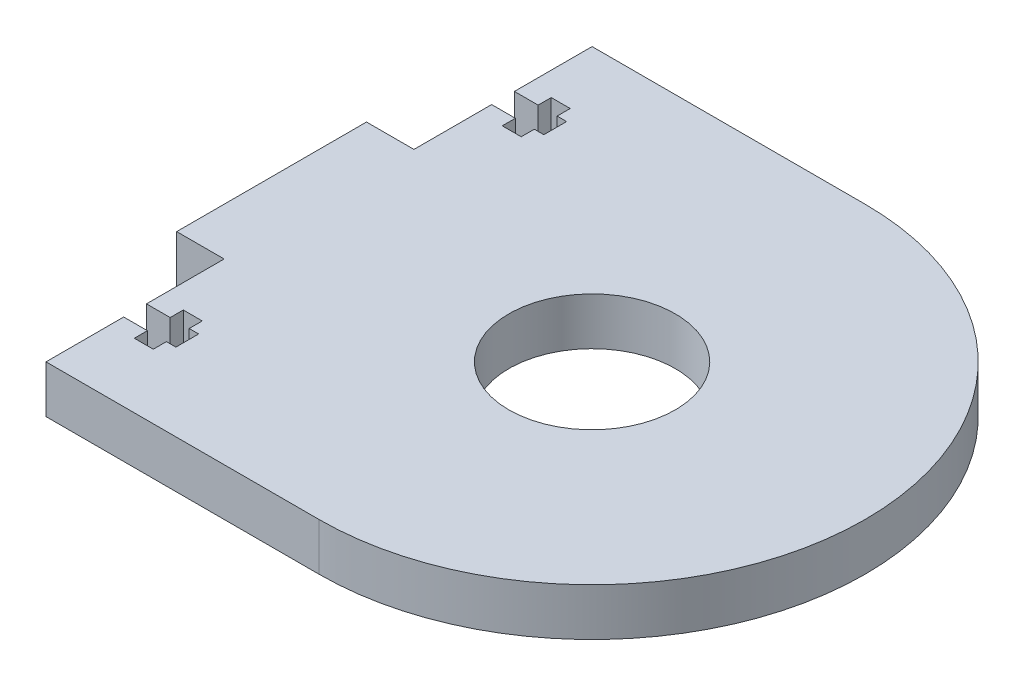
ISO-10303-21;
HEADER;
FILE_DESCRIPTION(('STEP AP214'),'2;1');
FILE_NAME('part.step','',(''),(''),'','','');
FILE_SCHEMA(('AUTOMOTIVE_DESIGN { 1 0 10303 214 1 1 1 1 }'));
ENDSEC;
DATA;
#1=APPLICATION_CONTEXT('core data for automotive mechanical design processes');
#2=APPLICATION_PROTOCOL_DEFINITION('international standard','automotive_design',2000,#1);
#3=PRODUCT_CONTEXT('',#1,'mechanical');
#4=PRODUCT('Part','Part','',(#3));
#5=PRODUCT_RELATED_PRODUCT_CATEGORY('part','',(#4));
#6=PRODUCT_DEFINITION_FORMATION('','',#4);
#7=PRODUCT_DEFINITION_CONTEXT('part definition',#1,'design');
#8=PRODUCT_DEFINITION('design','',#6,#7);
#9=PRODUCT_DEFINITION_SHAPE('','',#8);
#10=(LENGTH_UNIT() NAMED_UNIT(*) SI_UNIT(.MILLI.,.METRE.));
#11=(NAMED_UNIT(*) PLANE_ANGLE_UNIT() SI_UNIT($,.RADIAN.));
#12=(NAMED_UNIT(*) SI_UNIT($,.STERADIAN.) SOLID_ANGLE_UNIT());
#13=UNCERTAINTY_MEASURE_WITH_UNIT(LENGTH_MEASURE(1.E-05),#10,'distance_accuracy_value','');
#14=(GEOMETRIC_REPRESENTATION_CONTEXT(3) GLOBAL_UNCERTAINTY_ASSIGNED_CONTEXT((#13)) GLOBAL_UNIT_ASSIGNED_CONTEXT((#10,
#11,#12)) REPRESENTATION_CONTEXT('',''));
#15=CARTESIAN_POINT('',(0.,0.,0.));
#16=DIRECTION('',(0.,0.,1.));
#17=DIRECTION('',(1.,0.,0.));
#18=AXIS2_PLACEMENT_3D('',#15,#16,#17);
#19=CARTESIAN_POINT('',(2.36809678728789,6.35,0.403451606355909));
#20=DIRECTION('',(0.,1.,0.));
#21=DIRECTION('',(0.,0.,1.));
#22=AXIS2_PLACEMENT_3D('',#19,#20,#21);
#23=PLANE('',#22);
#24=CARTESIAN_POINT('',(2.36809678728789,6.35,0.403451606355909));
#25=DIRECTION('',(0.,1.,0.));
#26=DIRECTION('',(0.,0.,1.));
#27=AXIS2_PLACEMENT_3D('',#24,#25,#26);
#28=CIRCLE('',#27,36.5379);
#29=CARTESIAN_POINT('',(2.36809678728811,6.35,36.9413516063559));
#30=VERTEX_POINT('',#29);
#31=CARTESIAN_POINT('',(2.36809678728789,6.35,-36.1344483936441));
#32=VERTEX_POINT('',#31);
#33=EDGE_CURVE('E336',#30,#32,#28,.T.);
#34=ORIENTED_EDGE('',*,*,#33,.T.);
#35=DIRECTION('',(-1.,0.,0.));
#36=VECTOR('',#35,1.);
#37=CARTESIAN_POINT('',(2.36809678728789,6.35,-36.1344483936441));
#38=LINE('',#37,#36);
#39=CARTESIAN_POINT('',(-34.169803212712,6.35,-36.1344483936439));
#40=VERTEX_POINT('',#39);
#41=EDGE_CURVE('E164',#32,#40,#38,.T.);
#42=ORIENTED_EDGE('',*,*,#41,.T.);
#43=DIRECTION('',(0.,0.,1.));
#44=VECTOR('',#43,1.);
#45=CARTESIAN_POINT('',(-34.169803212712,6.35,-36.1344483936439));
#46=LINE('',#45,#44);
#47=CARTESIAN_POINT('',(-34.169803212712,6.35,-25.7394632326821));
#48=VERTEX_POINT('',#47);
#49=EDGE_CURVE('E423',#40,#48,#46,.T.);
#50=ORIENTED_EDGE('',*,*,#49,.T.);
#51=DIRECTION('',(1.,0.,0.));
#52=VECTOR('',#51,1.);
#53=CARTESIAN_POINT('',(-30.9948032127121,6.35,-25.7394632326821));
#54=LINE('',#53,#52);
#55=CARTESIAN_POINT('',(-30.9948032127121,6.35,-25.7394632326821));
#56=VERTEX_POINT('',#55);
#57=EDGE_CURVE('E442',#48,#56,#54,.T.);
#58=ORIENTED_EDGE('',*,*,#57,.T.);
#59=DIRECTION('',(0.,0.,-1.));
#60=VECTOR('',#59,1.);
#61=CARTESIAN_POINT('',(-30.9948032127121,6.35,-27.4920632326822));
#62=LINE('',#61,#60);
#63=CARTESIAN_POINT('',(-30.9948032127121,6.35,-27.4920632326822));
#64=VERTEX_POINT('',#63);
#65=EDGE_CURVE('E439',#56,#64,#62,.T.);
#66=ORIENTED_EDGE('',*,*,#65,.T.);
#67=DIRECTION('',(1.,0.,0.));
#68=VECTOR('',#67,1.);
#69=CARTESIAN_POINT('',(-28.4548032127121,6.35,-27.4920632326822));
#70=LINE('',#69,#68);
#71=CARTESIAN_POINT('',(-28.4548032127121,6.35,-27.4920632326822));
#72=VERTEX_POINT('',#71);
#73=EDGE_CURVE('E441',#64,#72,#70,.T.);
#74=ORIENTED_EDGE('',*,*,#73,.T.);
#75=DIRECTION('',(0.,0.,1.));
#76=VECTOR('',#75,1.);
#77=CARTESIAN_POINT('',(-28.4548032127121,6.35,-25.7394632326821));
#78=LINE('',#77,#76);
#79=CARTESIAN_POINT('',(-28.4548032127121,6.35,-25.7394632326821));
#80=VERTEX_POINT('',#79);
#81=EDGE_CURVE('E444',#72,#80,#78,.T.);
#82=ORIENTED_EDGE('',*,*,#81,.T.);
#83=DIRECTION('',(1.,0.,0.));
#84=VECTOR('',#83,1.);
#85=CARTESIAN_POINT('',(-27.1848032127122,6.35,-25.7394632326821));
#86=LINE('',#85,#84);
#87=CARTESIAN_POINT('',(-27.1848032127122,6.35,-25.7394632326821));
#88=VERTEX_POINT('',#87);
#89=EDGE_CURVE('E450',#80,#88,#86,.T.);
#90=ORIENTED_EDGE('',*,*,#89,.T.);
#91=DIRECTION('',(0.,0.,1.));
#92=VECTOR('',#91,1.);
#93=CARTESIAN_POINT('',(-27.1848032127122,6.35,-25.7394632326821));
#94=LINE('',#93,#92);
#95=CARTESIAN_POINT('',(-27.1848032127122,6.35,-22.6916038765292));
#96=VERTEX_POINT('',#95);
#97=EDGE_CURVE('E452',#88,#96,#94,.T.);
#98=ORIENTED_EDGE('',*,*,#97,.T.);
#99=DIRECTION('',(-1.,0.,0.));
#100=VECTOR('',#99,1.);
#101=CARTESIAN_POINT('',(-27.1848032127122,6.35,-22.6916038765292));
#102=LINE('',#101,#100);
#103=CARTESIAN_POINT('',(-28.4548032127121,6.35,-22.6916038765292));
#104=VERTEX_POINT('',#103);
#105=EDGE_CURVE('E454',#96,#104,#102,.T.);
#106=ORIENTED_EDGE('',*,*,#105,.T.);
#107=DIRECTION('',(0.,0.,1.));
#108=VECTOR('',#107,1.);
#109=CARTESIAN_POINT('',(-28.4548032127121,6.35,-22.6916038765292));
#110=LINE('',#109,#108);
#111=CARTESIAN_POINT('',(-28.4548032127121,6.35,-20.9390038765292));
#112=VERTEX_POINT('',#111);
#113=EDGE_CURVE('E456',#104,#112,#110,.T.);
#114=ORIENTED_EDGE('',*,*,#113,.T.);
#115=DIRECTION('',(-1.,0.,0.));
#116=VECTOR('',#115,1.);
#117=CARTESIAN_POINT('',(-28.4548032127121,6.35,-20.9390038765292));
#118=LINE('',#117,#116);
#119=CARTESIAN_POINT('',(-30.9948032127121,6.35,-20.9390038765292));
#120=VERTEX_POINT('',#119);
#121=EDGE_CURVE('E458',#112,#120,#118,.T.);
#122=ORIENTED_EDGE('',*,*,#121,.T.);
#123=DIRECTION('',(0.,0.,-1.));
#124=VECTOR('',#123,1.);
#125=CARTESIAN_POINT('',(-30.9948032127121,6.35,-20.9390038765292));
#126=LINE('',#125,#124);
#127=CARTESIAN_POINT('',(-30.9948032127121,6.35,-22.6916038765292));
#128=VERTEX_POINT('',#127);
#129=EDGE_CURVE('E460',#120,#128,#126,.T.);
#130=ORIENTED_EDGE('',*,*,#129,.T.);
#131=DIRECTION('',(-1.,0.,0.));
#132=VECTOR('',#131,1.);
#133=CARTESIAN_POINT('',(-30.9948032127121,6.35,-22.6916038765292));
#134=LINE('',#133,#132);
#135=CARTESIAN_POINT('',(-34.169803212712,6.35,-22.6916038765292));
#136=VERTEX_POINT('',#135);
#137=EDGE_CURVE('E462',#128,#136,#134,.T.);
#138=ORIENTED_EDGE('',*,*,#137,.T.);
#139=DIRECTION('',(0.,0.,1.));
#140=VECTOR('',#139,1.);
#141=CARTESIAN_POINT('',(-34.169803212712,6.35,-22.6916038765292));
#142=LINE('',#141,#140);
#143=CARTESIAN_POINT('',(-34.1698032127118,6.35,-12.2965483936441));
#144=VERTEX_POINT('',#143);
#145=EDGE_CURVE('E464',#136,#144,#142,.T.);
#146=ORIENTED_EDGE('',*,*,#145,.T.);
#147=DIRECTION('',(-1.,0.,0.));
#148=VECTOR('',#147,1.);
#149=CARTESIAN_POINT('',(-34.1698032127118,6.35,-12.2965483936441));
#150=LINE('',#149,#148);
#151=CARTESIAN_POINT('',(-40.5198032127117,6.35,-12.2965483936441));
#152=VERTEX_POINT('',#151);
#153=EDGE_CURVE('E466',#144,#152,#150,.T.);
#154=ORIENTED_EDGE('',*,*,#153,.T.);
#155=DIRECTION('',(0.,0.,1.));
#156=VECTOR('',#155,1.);
#157=CARTESIAN_POINT('',(-40.5198032127117,6.35,-12.2965483936441));
#158=LINE('',#157,#156);
#159=CARTESIAN_POINT('',(-40.5198032127117,6.35,13.1034516063559));
#160=VERTEX_POINT('',#159);
#161=EDGE_CURVE('E468',#152,#160,#158,.T.);
#162=ORIENTED_EDGE('',*,*,#161,.T.);
#163=DIRECTION('',(1.,0.,0.));
#164=VECTOR('',#163,1.);
#165=CARTESIAN_POINT('',(-40.5198032127117,6.35,13.1034516063559));
#166=LINE('',#165,#164);
#167=CARTESIAN_POINT('',(-34.1698032127118,6.35,13.1034516063559));
#168=VERTEX_POINT('',#167);
#169=EDGE_CURVE('E470',#160,#168,#166,.T.);
#170=ORIENTED_EDGE('',*,*,#169,.T.);
#171=DIRECTION('',(0.,0.,1.));
#172=VECTOR('',#171,1.);
#173=CARTESIAN_POINT('',(-34.1698032127118,6.35,13.1034516063559));
#174=LINE('',#173,#172);
#175=CARTESIAN_POINT('',(-34.1698032127118,6.35,23.4984367673177));
#176=VERTEX_POINT('',#175);
#177=EDGE_CURVE('E472',#168,#176,#174,.T.);
#178=ORIENTED_EDGE('',*,*,#177,.T.);
#179=DIRECTION('',(1.,0.,0.));
#180=VECTOR('',#179,1.);
#181=CARTESIAN_POINT('',(-30.9948032127116,6.35,23.4984367673177));
#182=LINE('',#181,#180);
#183=CARTESIAN_POINT('',(-30.9948032127116,6.35,23.4984367673177));
#184=VERTEX_POINT('',#183);
#185=EDGE_CURVE('E474',#176,#184,#182,.T.);
#186=ORIENTED_EDGE('',*,*,#185,.T.);
#187=DIRECTION('',(0.,0.,-1.));
#188=VECTOR('',#187,1.);
#189=CARTESIAN_POINT('',(-30.9948032127116,6.35,21.7458367673177));
#190=LINE('',#189,#188);
#191=CARTESIAN_POINT('',(-30.9948032127116,6.35,21.7458367673177));
#192=VERTEX_POINT('',#191);
#193=EDGE_CURVE('E476',#184,#192,#190,.T.);
#194=ORIENTED_EDGE('',*,*,#193,.T.);
#195=DIRECTION('',(1.,0.,0.));
#196=VECTOR('',#195,1.);
#197=CARTESIAN_POINT('',(-28.4548032127117,6.35,21.7458367673177));
#198=LINE('',#197,#196);
#199=CARTESIAN_POINT('',(-28.4548032127117,6.35,21.7458367673177));
#200=VERTEX_POINT('',#199);
#201=EDGE_CURVE('E478',#192,#200,#198,.T.);
#202=ORIENTED_EDGE('',*,*,#201,.T.);
#203=DIRECTION('',(0.,0.,1.));
#204=VECTOR('',#203,1.);
#205=CARTESIAN_POINT('',(-28.4548032127117,6.35,23.4984367673177));
#206=LINE('',#205,#204);
#207=CARTESIAN_POINT('',(-28.4548032127117,6.35,23.4984367673177));
#208=VERTEX_POINT('',#207);
#209=EDGE_CURVE('E480',#200,#208,#206,.T.);
#210=ORIENTED_EDGE('',*,*,#209,.T.);
#211=DIRECTION('',(1.,0.,0.));
#212=VECTOR('',#211,1.);
#213=CARTESIAN_POINT('',(-27.1848032127118,6.35,23.4984367673177));
#214=LINE('',#213,#212);
#215=CARTESIAN_POINT('',(-27.1848032127118,6.35,23.4984367673177));
#216=VERTEX_POINT('',#215);
#217=EDGE_CURVE('E482',#208,#216,#214,.T.);
#218=ORIENTED_EDGE('',*,*,#217,.T.);
#219=DIRECTION('',(0.,0.,1.));
#220=VECTOR('',#219,1.);
#221=CARTESIAN_POINT('',(-27.1848032127118,6.35,23.4984367673177));
#222=LINE('',#221,#220);
#223=CARTESIAN_POINT('',(-27.1848032127118,6.35,26.5462961234706));
#224=VERTEX_POINT('',#223);
#225=EDGE_CURVE('E484',#216,#224,#222,.T.);
#226=ORIENTED_EDGE('',*,*,#225,.T.);
#227=DIRECTION('',(-1.,0.,0.));
#228=VECTOR('',#227,1.);
#229=CARTESIAN_POINT('',(-27.1848032127118,6.35,26.5462961234706));
#230=LINE('',#229,#228);
#231=CARTESIAN_POINT('',(-28.4548032127117,6.35,26.5462961234706));
#232=VERTEX_POINT('',#231);
#233=EDGE_CURVE('E486',#224,#232,#230,.T.);
#234=ORIENTED_EDGE('',*,*,#233,.T.);
#235=DIRECTION('',(0.,0.,1.));
#236=VECTOR('',#235,1.);
#237=CARTESIAN_POINT('',(-28.4548032127117,6.35,26.5462961234706));
#238=LINE('',#237,#236);
#239=CARTESIAN_POINT('',(-28.4548032127117,6.35,28.2988961234707));
#240=VERTEX_POINT('',#239);
#241=EDGE_CURVE('E488',#232,#240,#238,.T.);
#242=ORIENTED_EDGE('',*,*,#241,.T.);
#243=DIRECTION('',(-1.,0.,0.));
#244=VECTOR('',#243,1.);
#245=CARTESIAN_POINT('',(-28.4548032127117,6.35,28.2988961234707));
#246=LINE('',#245,#244);
#247=CARTESIAN_POINT('',(-30.9948032127116,6.35,28.2988961234707));
#248=VERTEX_POINT('',#247);
#249=EDGE_CURVE('E490',#240,#248,#246,.T.);
#250=ORIENTED_EDGE('',*,*,#249,.T.);
#251=DIRECTION('',(0.,0.,-1.));
#252=VECTOR('',#251,1.);
#253=CARTESIAN_POINT('',(-30.9948032127116,6.35,28.2988961234707));
#254=LINE('',#253,#252);
#255=CARTESIAN_POINT('',(-30.9948032127116,6.35,26.5462961234706));
#256=VERTEX_POINT('',#255);
#257=EDGE_CURVE('E255',#248,#256,#254,.T.);
#258=ORIENTED_EDGE('',*,*,#257,.T.);
#259=DIRECTION('',(-1.,0.,0.));
#260=VECTOR('',#259,1.);
#261=CARTESIAN_POINT('',(-30.9948032127116,6.35,26.5462961234706));
#262=LINE('',#261,#260);
#263=CARTESIAN_POINT('',(-34.1698032127118,6.35,26.5462961234706));
#264=VERTEX_POINT('',#263);
#265=EDGE_CURVE('E249',#256,#264,#262,.T.);
#266=ORIENTED_EDGE('',*,*,#265,.T.);
#267=DIRECTION('',(0.,0.,1.));
#268=VECTOR('',#267,1.);
#269=CARTESIAN_POINT('',(-34.1698032127118,6.35,26.5462961234706));
#270=LINE('',#269,#268);
#271=CARTESIAN_POINT('',(-34.1698032127118,6.35,36.9413516063559));
#272=VERTEX_POINT('',#271);
#273=EDGE_CURVE('E253',#264,#272,#270,.T.);
#274=ORIENTED_EDGE('',*,*,#273,.T.);
#275=DIRECTION('',(1.,0.,0.));
#276=VECTOR('',#275,1.);
#277=CARTESIAN_POINT('',(-34.1698032127118,6.35,36.9413516063559));
#278=LINE('',#277,#276);
#279=EDGE_CURVE('E49',#272,#30,#278,.T.);
#280=ORIENTED_EDGE('',*,*,#279,.T.);
#281=EDGE_LOOP('',(#34,#42,#50,#58,#66,#74,#82,#90,#98,#106,#114,#122,#130,#138,#146,#154,#162,
#170,#178,#186,#194,#202,#210,#218,#226,#234,#242,#250,#258,#266,#274,#280));
#282=FACE_BOUND('',#281,.T.);
#283=CARTESIAN_POINT('',(2.36809678728789,6.35,0.403451606355909));
#284=DIRECTION('',(0.,1.,0.));
#285=DIRECTION('',(0.,0.,1.));
#286=AXIS2_PLACEMENT_3D('',#283,#284,#285);
#287=CIRCLE('',#286,11.1379);
#288=CARTESIAN_POINT('',(2.36809678728789,6.35,11.5413516063559));
#289=VERTEX_POINT('',#288);
#290=EDGE_CURVE('E277',#289,#289,#287,.T.);
#291=ORIENTED_EDGE('',*,*,#290,.F.);
#292=EDGE_LOOP('',(#291));
#293=FACE_BOUND('',#292,.T.);
#294=ADVANCED_FACE('F32',(#282,#293),#23,.T.);
#295=CARTESIAN_POINT('',(2.36809678728789,0.,0.403451606355909));
#296=DIRECTION('',(0.,1.,0.));
#297=DIRECTION('',(0.,0.,1.));
#298=AXIS2_PLACEMENT_3D('',#295,#296,#297);
#299=PLANE('',#298);
#300=CARTESIAN_POINT('',(2.36809678728789,0.,0.403451606355909));
#301=DIRECTION('',(0.,1.,0.));
#302=DIRECTION('',(0.,0.,1.));
#303=AXIS2_PLACEMENT_3D('',#300,#301,#302);
#304=CIRCLE('',#303,36.5379);
#305=CARTESIAN_POINT('',(2.36809678728811,0.,36.9413516063559));
#306=VERTEX_POINT('',#305);
#307=CARTESIAN_POINT('',(2.36809678728789,0.,-36.1344483936441));
#308=VERTEX_POINT('',#307);
#309=EDGE_CURVE('E273',#306,#308,#304,.T.);
#310=ORIENTED_EDGE('',*,*,#309,.F.);
#311=DIRECTION('',(1.,0.,0.));
#312=VECTOR('',#311,1.);
#313=CARTESIAN_POINT('',(-34.1698032127118,0.,36.9413516063559));
#314=LINE('',#313,#312);
#315=CARTESIAN_POINT('',(-34.1698032127118,0.,36.9413516063559));
#316=VERTEX_POINT('',#315);
#317=EDGE_CURVE('E156',#316,#306,#314,.T.);
#318=ORIENTED_EDGE('',*,*,#317,.F.);
#319=DIRECTION('',(0.,0.,1.));
#320=VECTOR('',#319,1.);
#321=CARTESIAN_POINT('',(-34.1698032127118,0.,26.5462961234706));
#322=LINE('',#321,#320);
#323=CARTESIAN_POINT('',(-34.1698032127118,0.,26.5462961234706));
#324=VERTEX_POINT('',#323);
#325=EDGE_CURVE('E150',#324,#316,#322,.T.);
#326=ORIENTED_EDGE('',*,*,#325,.F.);
#327=DIRECTION('',(-1.,0.,0.));
#328=VECTOR('',#327,1.);
#329=CARTESIAN_POINT('',(-30.9948032127116,0.,26.5462961234706));
#330=LINE('',#329,#328);
#331=CARTESIAN_POINT('',(-30.9948032127116,0.,26.5462961234706));
#332=VERTEX_POINT('',#331);
#333=EDGE_CURVE('E263',#332,#324,#330,.T.);
#334=ORIENTED_EDGE('',*,*,#333,.F.);
#335=DIRECTION('',(0.,0.,-1.));
#336=VECTOR('',#335,1.);
#337=CARTESIAN_POINT('',(-30.9948032127116,0.,28.2988961234707));
#338=LINE('',#337,#336);
#339=CARTESIAN_POINT('',(-30.9948032127116,0.,28.2988961234707));
#340=VERTEX_POINT('',#339);
#341=EDGE_CURVE('E331',#340,#332,#338,.T.);
#342=ORIENTED_EDGE('',*,*,#341,.F.);
#343=DIRECTION('',(-1.,0.,0.));
#344=VECTOR('',#343,1.);
#345=CARTESIAN_POINT('',(-28.4548032127117,0.,28.2988961234707));
#346=LINE('',#345,#344);
#347=CARTESIAN_POINT('',(-28.4548032127117,0.,28.2988961234707));
#348=VERTEX_POINT('',#347);
#349=EDGE_CURVE('E329',#348,#340,#346,.T.);
#350=ORIENTED_EDGE('',*,*,#349,.F.);
#351=DIRECTION('',(0.,0.,1.));
#352=VECTOR('',#351,1.);
#353=CARTESIAN_POINT('',(-28.4548032127117,0.,26.5462961234706));
#354=LINE('',#353,#352);
#355=CARTESIAN_POINT('',(-28.4548032127117,0.,26.5462961234706));
#356=VERTEX_POINT('',#355);
#357=EDGE_CURVE('E327',#356,#348,#354,.T.);
#358=ORIENTED_EDGE('',*,*,#357,.F.);
#359=DIRECTION('',(-1.,0.,0.));
#360=VECTOR('',#359,1.);
#361=CARTESIAN_POINT('',(-27.1848032127118,0.,26.5462961234706));
#362=LINE('',#361,#360);
#363=CARTESIAN_POINT('',(-27.1848032127118,0.,26.5462961234706));
#364=VERTEX_POINT('',#363);
#365=EDGE_CURVE('E325',#364,#356,#362,.T.);
#366=ORIENTED_EDGE('',*,*,#365,.F.);
#367=DIRECTION('',(0.,0.,1.));
#368=VECTOR('',#367,1.);
#369=CARTESIAN_POINT('',(-27.1848032127118,0.,23.4984367673177));
#370=LINE('',#369,#368);
#371=CARTESIAN_POINT('',(-27.1848032127118,0.,23.4984367673177));
#372=VERTEX_POINT('',#371);
#373=EDGE_CURVE('E323',#372,#364,#370,.T.);
#374=ORIENTED_EDGE('',*,*,#373,.F.);
#375=DIRECTION('',(1.,0.,0.));
#376=VECTOR('',#375,1.);
#377=CARTESIAN_POINT('',(-27.1848032127118,0.,23.4984367673177));
#378=LINE('',#377,#376);
#379=CARTESIAN_POINT('',(-28.4548032127117,0.,23.4984367673177));
#380=VERTEX_POINT('',#379);
#381=EDGE_CURVE('E321',#380,#372,#378,.T.);
#382=ORIENTED_EDGE('',*,*,#381,.F.);
#383=DIRECTION('',(0.,0.,1.));
#384=VECTOR('',#383,1.);
#385=CARTESIAN_POINT('',(-28.4548032127117,0.,23.4984367673177));
#386=LINE('',#385,#384);
#387=CARTESIAN_POINT('',(-28.4548032127117,0.,21.7458367673177));
#388=VERTEX_POINT('',#387);
#389=EDGE_CURVE('E319',#388,#380,#386,.T.);
#390=ORIENTED_EDGE('',*,*,#389,.F.);
#391=DIRECTION('',(1.,0.,0.));
#392=VECTOR('',#391,1.);
#393=CARTESIAN_POINT('',(-28.4548032127117,0.,21.7458367673177));
#394=LINE('',#393,#392);
#395=CARTESIAN_POINT('',(-30.9948032127116,0.,21.7458367673177));
#396=VERTEX_POINT('',#395);
#397=EDGE_CURVE('E317',#396,#388,#394,.T.);
#398=ORIENTED_EDGE('',*,*,#397,.F.);
#399=DIRECTION('',(0.,0.,-1.));
#400=VECTOR('',#399,1.);
#401=CARTESIAN_POINT('',(-30.9948032127116,0.,21.7458367673177));
#402=LINE('',#401,#400);
#403=CARTESIAN_POINT('',(-30.9948032127116,0.,23.4984367673177));
#404=VERTEX_POINT('',#403);
#405=EDGE_CURVE('E315',#404,#396,#402,.T.);
#406=ORIENTED_EDGE('',*,*,#405,.F.);
#407=DIRECTION('',(1.,0.,0.));
#408=VECTOR('',#407,1.);
#409=CARTESIAN_POINT('',(-30.9948032127116,0.,23.4984367673177));
#410=LINE('',#409,#408);
#411=CARTESIAN_POINT('',(-34.1698032127118,0.,23.4984367673177));
#412=VERTEX_POINT('',#411);
#413=EDGE_CURVE('E313',#412,#404,#410,.T.);
#414=ORIENTED_EDGE('',*,*,#413,.F.);
#415=DIRECTION('',(0.,0.,1.));
#416=VECTOR('',#415,1.);
#417=CARTESIAN_POINT('',(-34.1698032127118,0.,13.1034516063559));
#418=LINE('',#417,#416);
#419=CARTESIAN_POINT('',(-34.1698032127118,0.,13.1034516063559));
#420=VERTEX_POINT('',#419);
#421=EDGE_CURVE('E311',#420,#412,#418,.T.);
#422=ORIENTED_EDGE('',*,*,#421,.F.);
#423=DIRECTION('',(1.,0.,0.));
#424=VECTOR('',#423,1.);
#425=CARTESIAN_POINT('',(-40.5198032127117,0.,13.1034516063559));
#426=LINE('',#425,#424);
#427=CARTESIAN_POINT('',(-40.5198032127117,0.,13.1034516063559));
#428=VERTEX_POINT('',#427);
#429=EDGE_CURVE('E309',#428,#420,#426,.T.);
#430=ORIENTED_EDGE('',*,*,#429,.F.);
#431=DIRECTION('',(0.,0.,1.));
#432=VECTOR('',#431,1.);
#433=CARTESIAN_POINT('',(-40.5198032127117,0.,-12.2965483936441));
#434=LINE('',#433,#432);
#435=CARTESIAN_POINT('',(-40.5198032127117,0.,-12.2965483936441));
#436=VERTEX_POINT('',#435);
#437=EDGE_CURVE('E307',#436,#428,#434,.T.);
#438=ORIENTED_EDGE('',*,*,#437,.F.);
#439=DIRECTION('',(-1.,0.,0.));
#440=VECTOR('',#439,1.);
#441=CARTESIAN_POINT('',(-34.1698032127118,0.,-12.2965483936441));
#442=LINE('',#441,#440);
#443=CARTESIAN_POINT('',(-34.1698032127118,0.,-12.2965483936441));
#444=VERTEX_POINT('',#443);
#445=EDGE_CURVE('E305',#444,#436,#442,.T.);
#446=ORIENTED_EDGE('',*,*,#445,.F.);
#447=DIRECTION('',(0.,0.,1.));
#448=VECTOR('',#447,1.);
#449=CARTESIAN_POINT('',(-34.169803212712,0.,-22.6916038765292));
#450=LINE('',#449,#448);
#451=CARTESIAN_POINT('',(-34.169803212712,0.,-22.6916038765292));
#452=VERTEX_POINT('',#451);
#453=EDGE_CURVE('E303',#452,#444,#450,.T.);
#454=ORIENTED_EDGE('',*,*,#453,.F.);
#455=DIRECTION('',(-1.,0.,0.));
#456=VECTOR('',#455,1.);
#457=CARTESIAN_POINT('',(-30.9948032127121,0.,-22.6916038765292));
#458=LINE('',#457,#456);
#459=CARTESIAN_POINT('',(-30.9948032127121,0.,-22.6916038765292));
#460=VERTEX_POINT('',#459);
#461=EDGE_CURVE('E301',#460,#452,#458,.T.);
#462=ORIENTED_EDGE('',*,*,#461,.F.);
#463=DIRECTION('',(0.,0.,-1.));
#464=VECTOR('',#463,1.);
#465=CARTESIAN_POINT('',(-30.9948032127121,0.,-20.9390038765292));
#466=LINE('',#465,#464);
#467=CARTESIAN_POINT('',(-30.9948032127121,0.,-20.9390038765292));
#468=VERTEX_POINT('',#467);
#469=EDGE_CURVE('E299',#468,#460,#466,.T.);
#470=ORIENTED_EDGE('',*,*,#469,.F.);
#471=DIRECTION('',(-1.,0.,0.));
#472=VECTOR('',#471,1.);
#473=CARTESIAN_POINT('',(-28.4548032127121,0.,-20.9390038765292));
#474=LINE('',#473,#472);
#475=CARTESIAN_POINT('',(-28.4548032127121,0.,-20.9390038765292));
#476=VERTEX_POINT('',#475);
#477=EDGE_CURVE('E297',#476,#468,#474,.T.);
#478=ORIENTED_EDGE('',*,*,#477,.F.);
#479=DIRECTION('',(0.,0.,1.));
#480=VECTOR('',#479,1.);
#481=CARTESIAN_POINT('',(-28.4548032127121,0.,-22.6916038765292));
#482=LINE('',#481,#480);
#483=CARTESIAN_POINT('',(-28.4548032127121,0.,-22.6916038765292));
#484=VERTEX_POINT('',#483);
#485=EDGE_CURVE('E295',#484,#476,#482,.T.);
#486=ORIENTED_EDGE('',*,*,#485,.F.);
#487=DIRECTION('',(-1.,0.,0.));
#488=VECTOR('',#487,1.);
#489=CARTESIAN_POINT('',(-27.1848032127122,0.,-22.6916038765292));
#490=LINE('',#489,#488);
#491=CARTESIAN_POINT('',(-27.1848032127122,0.,-22.6916038765292));
#492=VERTEX_POINT('',#491);
#493=EDGE_CURVE('E293',#492,#484,#490,.T.);
#494=ORIENTED_EDGE('',*,*,#493,.F.);
#495=DIRECTION('',(0.,0.,1.));
#496=VECTOR('',#495,1.);
#497=CARTESIAN_POINT('',(-27.1848032127122,0.,-25.7394632326821));
#498=LINE('',#497,#496);
#499=CARTESIAN_POINT('',(-27.1848032127122,0.,-25.7394632326821));
#500=VERTEX_POINT('',#499);
#501=EDGE_CURVE('E291',#500,#492,#498,.T.);
#502=ORIENTED_EDGE('',*,*,#501,.F.);
#503=DIRECTION('',(1.,0.,0.));
#504=VECTOR('',#503,1.);
#505=CARTESIAN_POINT('',(-27.1848032127122,0.,-25.7394632326821));
#506=LINE('',#505,#504);
#507=CARTESIAN_POINT('',(-28.4548032127121,0.,-25.7394632326821));
#508=VERTEX_POINT('',#507);
#509=EDGE_CURVE('E289',#508,#500,#506,.T.);
#510=ORIENTED_EDGE('',*,*,#509,.F.);
#511=DIRECTION('',(0.,0.,1.));
#512=VECTOR('',#511,1.);
#513=CARTESIAN_POINT('',(-28.4548032127121,0.,-25.7394632326821));
#514=LINE('',#513,#512);
#515=CARTESIAN_POINT('',(-28.4548032127121,0.,-27.4920632326822));
#516=VERTEX_POINT('',#515);
#517=EDGE_CURVE('E287',#516,#508,#514,.T.);
#518=ORIENTED_EDGE('',*,*,#517,.F.);
#519=DIRECTION('',(1.,0.,0.));
#520=VECTOR('',#519,1.);
#521=CARTESIAN_POINT('',(-28.4548032127121,0.,-27.4920632326822));
#522=LINE('',#521,#520);
#523=CARTESIAN_POINT('',(-30.9948032127121,0.,-27.4920632326822));
#524=VERTEX_POINT('',#523);
#525=EDGE_CURVE('E285',#524,#516,#522,.T.);
#526=ORIENTED_EDGE('',*,*,#525,.F.);
#527=DIRECTION('',(0.,0.,-1.));
#528=VECTOR('',#527,1.);
#529=CARTESIAN_POINT('',(-30.9948032127121,0.,-27.4920632326822));
#530=LINE('',#529,#528);
#531=CARTESIAN_POINT('',(-30.9948032127121,0.,-25.7394632326821));
#532=VERTEX_POINT('',#531);
#533=EDGE_CURVE('E283',#532,#524,#530,.T.);
#534=ORIENTED_EDGE('',*,*,#533,.F.);
#535=DIRECTION('',(1.,0.,0.));
#536=VECTOR('',#535,1.);
#537=CARTESIAN_POINT('',(-30.9948032127121,0.,-25.7394632326821));
#538=LINE('',#537,#536);
#539=CARTESIAN_POINT('',(-34.169803212712,0.,-25.7394632326821));
#540=VERTEX_POINT('',#539);
#541=EDGE_CURVE('E281',#540,#532,#538,.T.);
#542=ORIENTED_EDGE('',*,*,#541,.F.);
#543=DIRECTION('',(0.,0.,1.));
#544=VECTOR('',#543,1.);
#545=CARTESIAN_POINT('',(-34.169803212712,0.,-36.1344483936439));
#546=LINE('',#545,#544);
#547=CARTESIAN_POINT('',(-34.169803212712,0.,-36.1344483936439));
#548=VERTEX_POINT('',#547);
#549=EDGE_CURVE('E279',#548,#540,#546,.T.);
#550=ORIENTED_EDGE('',*,*,#549,.F.);
#551=DIRECTION('',(-1.,0.,0.));
#552=VECTOR('',#551,1.);
#553=CARTESIAN_POINT('',(2.36809678728789,0.,-36.1344483936441));
#554=LINE('',#553,#552);
#555=EDGE_CURVE('E276',#308,#548,#554,.T.);
#556=ORIENTED_EDGE('',*,*,#555,.F.);
#557=EDGE_LOOP('',(#310,#318,#326,#334,#342,#350,#358,#366,#374,#382,#390,#398,#406,#414,#422,
#430,#438,#446,#454,#462,#470,#478,#486,#494,#502,#510,#518,#526,#534,#542,#550,#556));
#558=FACE_BOUND('',#557,.T.);
#559=CARTESIAN_POINT('',(2.36809678728789,0.,0.403451606355909));
#560=DIRECTION('',(0.,1.,0.));
#561=DIRECTION('',(0.,0.,1.));
#562=AXIS2_PLACEMENT_3D('',#559,#560,#561);
#563=CIRCLE('',#562,11.1379);
#564=CARTESIAN_POINT('',(2.36809678728789,0.,11.5413516063559));
#565=VERTEX_POINT('',#564);
#566=EDGE_CURVE('E897',#565,#565,#563,.T.);
#567=ORIENTED_EDGE('',*,*,#566,.T.);
#568=EDGE_LOOP('',(#567));
#569=FACE_BOUND('',#568,.T.);
#570=ADVANCED_FACE('F427',(#558,#569),#299,.F.);
#571=CARTESIAN_POINT('',(2.36809678728789,6.35,0.403451606355909));
#572=DIRECTION('',(0.,-1.,0.));
#573=DIRECTION('',(0.,0.,-1.));
#574=AXIS2_PLACEMENT_3D('',#571,#572,#573);
#575=CYLINDRICAL_SURFACE('',#574,36.5379);
#576=ORIENTED_EDGE('',*,*,#309,.T.);
#577=DIRECTION('',(0.,-1.,0.));
#578=VECTOR('',#577,1.);
#579=CARTESIAN_POINT('',(2.36809678728789,6.35,-36.1344483936441));
#580=LINE('',#579,#578);
#581=EDGE_CURVE('E11',#32,#308,#580,.T.);
#582=ORIENTED_EDGE('',*,*,#581,.F.);
#583=ORIENTED_EDGE('',*,*,#33,.F.);
#584=DIRECTION('',(0.,-1.,0.));
#585=VECTOR('',#584,1.);
#586=CARTESIAN_POINT('',(2.36809678728811,6.35,36.9413516063559));
#587=LINE('',#586,#585);
#588=EDGE_CURVE('E269',#30,#306,#587,.T.);
#589=ORIENTED_EDGE('',*,*,#588,.T.);
#590=EDGE_LOOP('',(#576,#582,#583,#589));
#591=FACE_BOUND('',#590,.T.);
#592=ADVANCED_FACE('F34',(#591),#575,.T.);
#593=CARTESIAN_POINT('',(2.36809678728789,6.35,-36.1344483936441));
#594=DIRECTION('',(0.,0.,1.));
#595=DIRECTION('',(1.,0.,0.));
#596=AXIS2_PLACEMENT_3D('',#593,#594,#595);
#597=PLANE('',#596);
#598=ORIENTED_EDGE('',*,*,#555,.T.);
#599=DIRECTION('',(0.,-1.,0.));
#600=VECTOR('',#599,1.);
#601=CARTESIAN_POINT('',(-34.169803212712,6.35,-36.1344483936439));
#602=LINE('',#601,#600);
#603=EDGE_CURVE('E41',#40,#548,#602,.T.);
#604=ORIENTED_EDGE('',*,*,#603,.F.);
#605=ORIENTED_EDGE('',*,*,#41,.F.);
#606=ORIENTED_EDGE('',*,*,#581,.T.);
#607=EDGE_LOOP('',(#598,#604,#605,#606));
#608=FACE_BOUND('',#607,.T.);
#609=ADVANCED_FACE('F524',(#608),#597,.F.);
#610=CARTESIAN_POINT('',(-34.169803212712,6.35,-36.1344483936439));
#611=DIRECTION('',(1.,0.,0.));
#612=DIRECTION('',(0.,0.,-1.));
#613=AXIS2_PLACEMENT_3D('',#610,#611,#612);
#614=PLANE('',#613);
#615=ORIENTED_EDGE('',*,*,#549,.T.);
#616=DIRECTION('',(0.,-1.,0.));
#617=VECTOR('',#616,1.);
#618=CARTESIAN_POINT('',(-34.169803212712,6.35,-25.7394632326821));
#619=LINE('',#618,#617);
#620=EDGE_CURVE('E415',#48,#540,#619,.T.);
#621=ORIENTED_EDGE('',*,*,#620,.F.);
#622=ORIENTED_EDGE('',*,*,#49,.F.);
#623=ORIENTED_EDGE('',*,*,#603,.T.);
#624=EDGE_LOOP('',(#615,#621,#622,#623));
#625=FACE_BOUND('',#624,.T.);
#626=ADVANCED_FACE('F421',(#625),#614,.F.);
#627=CARTESIAN_POINT('',(-30.9948032127121,6.35,-25.7394632326821));
#628=DIRECTION('',(0.,0.,-1.));
#629=DIRECTION('',(-1.,0.,0.));
#630=AXIS2_PLACEMENT_3D('',#627,#628,#629);
#631=PLANE('',#630);
#632=ORIENTED_EDGE('',*,*,#541,.T.);
#633=DIRECTION('',(0.,-1.,0.));
#634=VECTOR('',#633,1.);
#635=CARTESIAN_POINT('',(-30.9948032127121,6.35,-25.7394632326821));
#636=LINE('',#635,#634);
#637=EDGE_CURVE('E412',#56,#532,#636,.T.);
#638=ORIENTED_EDGE('',*,*,#637,.F.);
#639=ORIENTED_EDGE('',*,*,#57,.F.);
#640=ORIENTED_EDGE('',*,*,#620,.T.);
#641=EDGE_LOOP('',(#632,#638,#639,#640));
#642=FACE_BOUND('',#641,.T.);
#643=ADVANCED_FACE('F433',(#642),#631,.F.);
#644=CARTESIAN_POINT('',(-30.9948032127121,6.35,-27.4920632326822));
#645=DIRECTION('',(-1.,0.,0.));
#646=DIRECTION('',(0.,0.,1.));
#647=AXIS2_PLACEMENT_3D('',#644,#645,#646);
#648=PLANE('',#647);
#649=ORIENTED_EDGE('',*,*,#533,.T.);
#650=DIRECTION('',(0.,-1.,0.));
#651=VECTOR('',#650,1.);
#652=CARTESIAN_POINT('',(-30.9948032127121,6.35,-27.4920632326822));
#653=LINE('',#652,#651);
#654=EDGE_CURVE('E409',#64,#524,#653,.T.);
#655=ORIENTED_EDGE('',*,*,#654,.F.);
#656=ORIENTED_EDGE('',*,*,#65,.F.);
#657=ORIENTED_EDGE('',*,*,#637,.T.);
#658=EDGE_LOOP('',(#649,#655,#656,#657));
#659=FACE_BOUND('',#658,.T.);
#660=ADVANCED_FACE('F437',(#659),#648,.F.);
#661=CARTESIAN_POINT('',(-28.4548032127121,6.35,-27.4920632326822));
#662=DIRECTION('',(0.,0.,-1.));
#663=DIRECTION('',(-1.,0.,0.));
#664=AXIS2_PLACEMENT_3D('',#661,#662,#663);
#665=PLANE('',#664);
#666=ORIENTED_EDGE('',*,*,#525,.T.);
#667=DIRECTION('',(0.,-1.,0.));
#668=VECTOR('',#667,1.);
#669=CARTESIAN_POINT('',(-28.4548032127121,6.35,-27.4920632326822));
#670=LINE('',#669,#668);
#671=EDGE_CURVE('E406',#72,#516,#670,.T.);
#672=ORIENTED_EDGE('',*,*,#671,.F.);
#673=ORIENTED_EDGE('',*,*,#73,.F.);
#674=ORIENTED_EDGE('',*,*,#654,.T.);
#675=EDGE_LOOP('',(#666,#672,#673,#674));
#676=FACE_BOUND('',#675,.T.);
#677=ADVANCED_FACE('F537',(#676),#665,.F.);
#678=CARTESIAN_POINT('',(-28.4548032127121,6.35,-25.7394632326821));
#679=DIRECTION('',(1.,0.,0.));
#680=DIRECTION('',(0.,0.,-1.));
#681=AXIS2_PLACEMENT_3D('',#678,#679,#680);
#682=PLANE('',#681);
#683=ORIENTED_EDGE('',*,*,#517,.T.);
#684=DIRECTION('',(0.,-1.,0.));
#685=VECTOR('',#684,1.);
#686=CARTESIAN_POINT('',(-28.4548032127121,6.35,-25.7394632326821));
#687=LINE('',#686,#685);
#688=EDGE_CURVE('E403',#80,#508,#687,.T.);
#689=ORIENTED_EDGE('',*,*,#688,.F.);
#690=ORIENTED_EDGE('',*,*,#81,.F.);
#691=ORIENTED_EDGE('',*,*,#671,.T.);
#692=EDGE_LOOP('',(#683,#689,#690,#691));
#693=FACE_BOUND('',#692,.T.);
#694=ADVANCED_FACE('F540',(#693),#682,.F.);
#695=CARTESIAN_POINT('',(-27.1848032127122,6.35,-25.7394632326821));
#696=DIRECTION('',(0.,0.,-1.));
#697=DIRECTION('',(-1.,0.,0.));
#698=AXIS2_PLACEMENT_3D('',#695,#696,#697);
#699=PLANE('',#698);
#700=ORIENTED_EDGE('',*,*,#509,.T.);
#701=DIRECTION('',(0.,-1.,0.));
#702=VECTOR('',#701,1.);
#703=CARTESIAN_POINT('',(-27.1848032127122,6.35,-25.7394632326821));
#704=LINE('',#703,#702);
#705=EDGE_CURVE('E400',#88,#500,#704,.T.);
#706=ORIENTED_EDGE('',*,*,#705,.F.);
#707=ORIENTED_EDGE('',*,*,#89,.F.);
#708=ORIENTED_EDGE('',*,*,#688,.T.);
#709=EDGE_LOOP('',(#700,#706,#707,#708));
#710=FACE_BOUND('',#709,.T.);
#711=ADVANCED_FACE('F544',(#710),#699,.F.);
#712=CARTESIAN_POINT('',(-27.1848032127122,6.35,-25.7394632326821));
#713=DIRECTION('',(1.,0.,0.));
#714=DIRECTION('',(0.,0.,-1.));
#715=AXIS2_PLACEMENT_3D('',#712,#713,#714);
#716=PLANE('',#715);
#717=ORIENTED_EDGE('',*,*,#501,.T.);
#718=DIRECTION('',(0.,-1.,0.));
#719=VECTOR('',#718,1.);
#720=CARTESIAN_POINT('',(-27.1848032127122,6.35,-22.6916038765292));
#721=LINE('',#720,#719);
#722=EDGE_CURVE('E397',#96,#492,#721,.T.);
#723=ORIENTED_EDGE('',*,*,#722,.F.);
#724=ORIENTED_EDGE('',*,*,#97,.F.);
#725=ORIENTED_EDGE('',*,*,#705,.T.);
#726=EDGE_LOOP('',(#717,#723,#724,#725));
#727=FACE_BOUND('',#726,.T.);
#728=ADVANCED_FACE('F548',(#727),#716,.F.);
#729=CARTESIAN_POINT('',(-27.1848032127122,6.35,-22.6916038765292));
#730=DIRECTION('',(0.,0.,1.));
#731=DIRECTION('',(1.,0.,0.));
#732=AXIS2_PLACEMENT_3D('',#729,#730,#731);
#733=PLANE('',#732);
#734=ORIENTED_EDGE('',*,*,#493,.T.);
#735=DIRECTION('',(0.,-1.,0.));
#736=VECTOR('',#735,1.);
#737=CARTESIAN_POINT('',(-28.4548032127121,6.35,-22.6916038765292));
#738=LINE('',#737,#736);
#739=EDGE_CURVE('E394',#104,#484,#738,.T.);
#740=ORIENTED_EDGE('',*,*,#739,.F.);
#741=ORIENTED_EDGE('',*,*,#105,.F.);
#742=ORIENTED_EDGE('',*,*,#722,.T.);
#743=EDGE_LOOP('',(#734,#740,#741,#742));
#744=FACE_BOUND('',#743,.T.);
#745=ADVANCED_FACE('F552',(#744),#733,.F.);
#746=CARTESIAN_POINT('',(-28.4548032127121,6.35,-22.6916038765292));
#747=DIRECTION('',(1.,0.,0.));
#748=DIRECTION('',(0.,0.,-1.));
#749=AXIS2_PLACEMENT_3D('',#746,#747,#748);
#750=PLANE('',#749);
#751=ORIENTED_EDGE('',*,*,#485,.T.);
#752=DIRECTION('',(0.,-1.,0.));
#753=VECTOR('',#752,1.);
#754=CARTESIAN_POINT('',(-28.4548032127121,6.35,-20.9390038765292));
#755=LINE('',#754,#753);
#756=EDGE_CURVE('E391',#112,#476,#755,.T.);
#757=ORIENTED_EDGE('',*,*,#756,.F.);
#758=ORIENTED_EDGE('',*,*,#113,.F.);
#759=ORIENTED_EDGE('',*,*,#739,.T.);
#760=EDGE_LOOP('',(#751,#757,#758,#759));
#761=FACE_BOUND('',#760,.T.);
#762=ADVANCED_FACE('F556',(#761),#750,.F.);
#763=CARTESIAN_POINT('',(-28.4548032127121,6.35,-20.9390038765292));
#764=DIRECTION('',(0.,0.,1.));
#765=DIRECTION('',(1.,0.,0.));
#766=AXIS2_PLACEMENT_3D('',#763,#764,#765);
#767=PLANE('',#766);
#768=ORIENTED_EDGE('',*,*,#477,.T.);
#769=DIRECTION('',(0.,-1.,0.));
#770=VECTOR('',#769,1.);
#771=CARTESIAN_POINT('',(-30.9948032127121,6.35,-20.9390038765292));
#772=LINE('',#771,#770);
#773=EDGE_CURVE('E388',#120,#468,#772,.T.);
#774=ORIENTED_EDGE('',*,*,#773,.F.);
#775=ORIENTED_EDGE('',*,*,#121,.F.);
#776=ORIENTED_EDGE('',*,*,#756,.T.);
#777=EDGE_LOOP('',(#768,#774,#775,#776));
#778=FACE_BOUND('',#777,.T.);
#779=ADVANCED_FACE('F560',(#778),#767,.F.);
#780=CARTESIAN_POINT('',(-30.9948032127121,6.35,-20.9390038765292));
#781=DIRECTION('',(-1.,0.,0.));
#782=DIRECTION('',(0.,0.,1.));
#783=AXIS2_PLACEMENT_3D('',#780,#781,#782);
#784=PLANE('',#783);
#785=ORIENTED_EDGE('',*,*,#469,.T.);
#786=DIRECTION('',(0.,-1.,0.));
#787=VECTOR('',#786,1.);
#788=CARTESIAN_POINT('',(-30.9948032127121,6.35,-22.6916038765292));
#789=LINE('',#788,#787);
#790=EDGE_CURVE('E385',#128,#460,#789,.T.);
#791=ORIENTED_EDGE('',*,*,#790,.F.);
#792=ORIENTED_EDGE('',*,*,#129,.F.);
#793=ORIENTED_EDGE('',*,*,#773,.T.);
#794=EDGE_LOOP('',(#785,#791,#792,#793));
#795=FACE_BOUND('',#794,.T.);
#796=ADVANCED_FACE('F564',(#795),#784,.F.);
#797=CARTESIAN_POINT('',(-30.9948032127121,6.35,-22.6916038765292));
#798=DIRECTION('',(0.,0.,1.));
#799=DIRECTION('',(1.,0.,0.));
#800=AXIS2_PLACEMENT_3D('',#797,#798,#799);
#801=PLANE('',#800);
#802=ORIENTED_EDGE('',*,*,#461,.T.);
#803=DIRECTION('',(0.,-1.,0.));
#804=VECTOR('',#803,1.);
#805=CARTESIAN_POINT('',(-34.169803212712,6.35,-22.6916038765292));
#806=LINE('',#805,#804);
#807=EDGE_CURVE('E382',#136,#452,#806,.T.);
#808=ORIENTED_EDGE('',*,*,#807,.F.);
#809=ORIENTED_EDGE('',*,*,#137,.F.);
#810=ORIENTED_EDGE('',*,*,#790,.T.);
#811=EDGE_LOOP('',(#802,#808,#809,#810));
#812=FACE_BOUND('',#811,.T.);
#813=ADVANCED_FACE('F568',(#812),#801,.F.);
#814=CARTESIAN_POINT('',(-34.169803212712,6.35,-22.6916038765292));
#815=DIRECTION('',(1.,0.,0.));
#816=DIRECTION('',(0.,0.,-1.));
#817=AXIS2_PLACEMENT_3D('',#814,#815,#816);
#818=PLANE('',#817);
#819=ORIENTED_EDGE('',*,*,#453,.T.);
#820=DIRECTION('',(0.,-1.,0.));
#821=VECTOR('',#820,1.);
#822=CARTESIAN_POINT('',(-34.1698032127118,6.35,-12.2965483936441));
#823=LINE('',#822,#821);
#824=EDGE_CURVE('E379',#144,#444,#823,.T.);
#825=ORIENTED_EDGE('',*,*,#824,.F.);
#826=ORIENTED_EDGE('',*,*,#145,.F.);
#827=ORIENTED_EDGE('',*,*,#807,.T.);
#828=EDGE_LOOP('',(#819,#825,#826,#827));
#829=FACE_BOUND('',#828,.T.);
#830=ADVANCED_FACE('F572',(#829),#818,.F.);
#831=CARTESIAN_POINT('',(-34.1698032127118,6.35,-12.2965483936441));
#832=DIRECTION('',(0.,0.,1.));
#833=DIRECTION('',(1.,0.,0.));
#834=AXIS2_PLACEMENT_3D('',#831,#832,#833);
#835=PLANE('',#834);
#836=ORIENTED_EDGE('',*,*,#445,.T.);
#837=DIRECTION('',(0.,-1.,0.));
#838=VECTOR('',#837,1.);
#839=CARTESIAN_POINT('',(-40.5198032127117,6.35,-12.2965483936441));
#840=LINE('',#839,#838);
#841=EDGE_CURVE('E376',#152,#436,#840,.T.);
#842=ORIENTED_EDGE('',*,*,#841,.F.);
#843=ORIENTED_EDGE('',*,*,#153,.F.);
#844=ORIENTED_EDGE('',*,*,#824,.T.);
#845=EDGE_LOOP('',(#836,#842,#843,#844));
#846=FACE_BOUND('',#845,.T.);
#847=ADVANCED_FACE('F576',(#846),#835,.F.);
#848=CARTESIAN_POINT('',(-40.5198032127117,6.35,-12.2965483936441));
#849=DIRECTION('',(1.,0.,0.));
#850=DIRECTION('',(0.,0.,-1.));
#851=AXIS2_PLACEMENT_3D('',#848,#849,#850);
#852=PLANE('',#851);
#853=ORIENTED_EDGE('',*,*,#437,.T.);
#854=DIRECTION('',(0.,-1.,0.));
#855=VECTOR('',#854,1.);
#856=CARTESIAN_POINT('',(-40.5198032127117,6.35,13.1034516063559));
#857=LINE('',#856,#855);
#858=EDGE_CURVE('E373',#160,#428,#857,.T.);
#859=ORIENTED_EDGE('',*,*,#858,.F.);
#860=ORIENTED_EDGE('',*,*,#161,.F.);
#861=ORIENTED_EDGE('',*,*,#841,.T.);
#862=EDGE_LOOP('',(#853,#859,#860,#861));
#863=FACE_BOUND('',#862,.T.);
#864=ADVANCED_FACE('F580',(#863),#852,.F.);
#865=CARTESIAN_POINT('',(-40.5198032127117,6.35,13.1034516063559));
#866=DIRECTION('',(0.,0.,-1.));
#867=DIRECTION('',(-1.,0.,0.));
#868=AXIS2_PLACEMENT_3D('',#865,#866,#867);
#869=PLANE('',#868);
#870=ORIENTED_EDGE('',*,*,#429,.T.);
#871=DIRECTION('',(0.,-1.,0.));
#872=VECTOR('',#871,1.);
#873=CARTESIAN_POINT('',(-34.1698032127118,6.35,13.1034516063559));
#874=LINE('',#873,#872);
#875=EDGE_CURVE('E370',#168,#420,#874,.T.);
#876=ORIENTED_EDGE('',*,*,#875,.F.);
#877=ORIENTED_EDGE('',*,*,#169,.F.);
#878=ORIENTED_EDGE('',*,*,#858,.T.);
#879=EDGE_LOOP('',(#870,#876,#877,#878));
#880=FACE_BOUND('',#879,.T.);
#881=ADVANCED_FACE('F584',(#880),#869,.F.);
#882=CARTESIAN_POINT('',(-34.1698032127118,6.35,13.1034516063559));
#883=DIRECTION('',(1.,0.,0.));
#884=DIRECTION('',(0.,0.,-1.));
#885=AXIS2_PLACEMENT_3D('',#882,#883,#884);
#886=PLANE('',#885);
#887=ORIENTED_EDGE('',*,*,#421,.T.);
#888=DIRECTION('',(0.,-1.,0.));
#889=VECTOR('',#888,1.);
#890=CARTESIAN_POINT('',(-34.1698032127118,6.35,23.4984367673177));
#891=LINE('',#890,#889);
#892=EDGE_CURVE('E367',#176,#412,#891,.T.);
#893=ORIENTED_EDGE('',*,*,#892,.F.);
#894=ORIENTED_EDGE('',*,*,#177,.F.);
#895=ORIENTED_EDGE('',*,*,#875,.T.);
#896=EDGE_LOOP('',(#887,#893,#894,#895));
#897=FACE_BOUND('',#896,.T.);
#898=ADVANCED_FACE('F588',(#897),#886,.F.);
#899=CARTESIAN_POINT('',(-30.9948032127116,6.35,23.4984367673177));
#900=DIRECTION('',(0.,0.,-1.));
#901=DIRECTION('',(-1.,0.,0.));
#902=AXIS2_PLACEMENT_3D('',#899,#900,#901);
#903=PLANE('',#902);
#904=ORIENTED_EDGE('',*,*,#413,.T.);
#905=DIRECTION('',(0.,-1.,0.));
#906=VECTOR('',#905,1.);
#907=CARTESIAN_POINT('',(-30.9948032127116,6.35,23.4984367673177));
#908=LINE('',#907,#906);
#909=EDGE_CURVE('E364',#184,#404,#908,.T.);
#910=ORIENTED_EDGE('',*,*,#909,.F.);
#911=ORIENTED_EDGE('',*,*,#185,.F.);
#912=ORIENTED_EDGE('',*,*,#892,.T.);
#913=EDGE_LOOP('',(#904,#910,#911,#912));
#914=FACE_BOUND('',#913,.T.);
#915=ADVANCED_FACE('F592',(#914),#903,.F.);
#916=CARTESIAN_POINT('',(-30.9948032127116,6.35,21.7458367673177));
#917=DIRECTION('',(-1.,0.,0.));
#918=DIRECTION('',(0.,0.,1.));
#919=AXIS2_PLACEMENT_3D('',#916,#917,#918);
#920=PLANE('',#919);
#921=ORIENTED_EDGE('',*,*,#405,.T.);
#922=DIRECTION('',(0.,-1.,0.));
#923=VECTOR('',#922,1.);
#924=CARTESIAN_POINT('',(-30.9948032127116,6.35,21.7458367673177));
#925=LINE('',#924,#923);
#926=EDGE_CURVE('E361',#192,#396,#925,.T.);
#927=ORIENTED_EDGE('',*,*,#926,.F.);
#928=ORIENTED_EDGE('',*,*,#193,.F.);
#929=ORIENTED_EDGE('',*,*,#909,.T.);
#930=EDGE_LOOP('',(#921,#927,#928,#929));
#931=FACE_BOUND('',#930,.T.);
#932=ADVANCED_FACE('F596',(#931),#920,.F.);
#933=CARTESIAN_POINT('',(-28.4548032127117,6.35,21.7458367673177));
#934=DIRECTION('',(0.,0.,-1.));
#935=DIRECTION('',(-1.,0.,0.));
#936=AXIS2_PLACEMENT_3D('',#933,#934,#935);
#937=PLANE('',#936);
#938=ORIENTED_EDGE('',*,*,#397,.T.);
#939=DIRECTION('',(0.,-1.,0.));
#940=VECTOR('',#939,1.);
#941=CARTESIAN_POINT('',(-28.4548032127117,6.35,21.7458367673177));
#942=LINE('',#941,#940);
#943=EDGE_CURVE('E358',#200,#388,#942,.T.);
#944=ORIENTED_EDGE('',*,*,#943,.F.);
#945=ORIENTED_EDGE('',*,*,#201,.F.);
#946=ORIENTED_EDGE('',*,*,#926,.T.);
#947=EDGE_LOOP('',(#938,#944,#945,#946));
#948=FACE_BOUND('',#947,.T.);
#949=ADVANCED_FACE('F600',(#948),#937,.F.);
#950=CARTESIAN_POINT('',(-28.4548032127117,6.35,23.4984367673177));
#951=DIRECTION('',(1.,0.,0.));
#952=DIRECTION('',(0.,0.,-1.));
#953=AXIS2_PLACEMENT_3D('',#950,#951,#952);
#954=PLANE('',#953);
#955=ORIENTED_EDGE('',*,*,#389,.T.);
#956=DIRECTION('',(0.,-1.,0.));
#957=VECTOR('',#956,1.);
#958=CARTESIAN_POINT('',(-28.4548032127117,6.35,23.4984367673177));
#959=LINE('',#958,#957);
#960=EDGE_CURVE('E355',#208,#380,#959,.T.);
#961=ORIENTED_EDGE('',*,*,#960,.F.);
#962=ORIENTED_EDGE('',*,*,#209,.F.);
#963=ORIENTED_EDGE('',*,*,#943,.T.);
#964=EDGE_LOOP('',(#955,#961,#962,#963));
#965=FACE_BOUND('',#964,.T.);
#966=ADVANCED_FACE('F604',(#965),#954,.F.);
#967=CARTESIAN_POINT('',(-27.1848032127118,6.35,23.4984367673177));
#968=DIRECTION('',(0.,0.,-1.));
#969=DIRECTION('',(-1.,0.,0.));
#970=AXIS2_PLACEMENT_3D('',#967,#968,#969);
#971=PLANE('',#970);
#972=ORIENTED_EDGE('',*,*,#381,.T.);
#973=DIRECTION('',(0.,-1.,0.));
#974=VECTOR('',#973,1.);
#975=CARTESIAN_POINT('',(-27.1848032127118,6.35,23.4984367673177));
#976=LINE('',#975,#974);
#977=EDGE_CURVE('E352',#216,#372,#976,.T.);
#978=ORIENTED_EDGE('',*,*,#977,.F.);
#979=ORIENTED_EDGE('',*,*,#217,.F.);
#980=ORIENTED_EDGE('',*,*,#960,.T.);
#981=EDGE_LOOP('',(#972,#978,#979,#980));
#982=FACE_BOUND('',#981,.T.);
#983=ADVANCED_FACE('F608',(#982),#971,.F.);
#984=CARTESIAN_POINT('',(-27.1848032127118,6.35,23.4984367673177));
#985=DIRECTION('',(1.,0.,0.));
#986=DIRECTION('',(0.,0.,-1.));
#987=AXIS2_PLACEMENT_3D('',#984,#985,#986);
#988=PLANE('',#987);
#989=ORIENTED_EDGE('',*,*,#373,.T.);
#990=DIRECTION('',(0.,-1.,0.));
#991=VECTOR('',#990,1.);
#992=CARTESIAN_POINT('',(-27.1848032127118,6.35,26.5462961234706));
#993=LINE('',#992,#991);
#994=EDGE_CURVE('E349',#224,#364,#993,.T.);
#995=ORIENTED_EDGE('',*,*,#994,.F.);
#996=ORIENTED_EDGE('',*,*,#225,.F.);
#997=ORIENTED_EDGE('',*,*,#977,.T.);
#998=EDGE_LOOP('',(#989,#995,#996,#997));
#999=FACE_BOUND('',#998,.T.);
#1000=ADVANCED_FACE('F612',(#999),#988,.F.);
#1001=CARTESIAN_POINT('',(-27.1848032127118,6.35,26.5462961234706));
#1002=DIRECTION('',(0.,0.,1.));
#1003=DIRECTION('',(1.,0.,0.));
#1004=AXIS2_PLACEMENT_3D('',#1001,#1002,#1003);
#1005=PLANE('',#1004);
#1006=ORIENTED_EDGE('',*,*,#365,.T.);
#1007=DIRECTION('',(0.,-1.,0.));
#1008=VECTOR('',#1007,1.);
#1009=CARTESIAN_POINT('',(-28.4548032127117,6.35,26.5462961234706));
#1010=LINE('',#1009,#1008);
#1011=EDGE_CURVE('E346',#232,#356,#1010,.T.);
#1012=ORIENTED_EDGE('',*,*,#1011,.F.);
#1013=ORIENTED_EDGE('',*,*,#233,.F.);
#1014=ORIENTED_EDGE('',*,*,#994,.T.);
#1015=EDGE_LOOP('',(#1006,#1012,#1013,#1014));
#1016=FACE_BOUND('',#1015,.T.);
#1017=ADVANCED_FACE('F616',(#1016),#1005,.F.);
#1018=CARTESIAN_POINT('',(-28.4548032127117,6.35,26.5462961234706));
#1019=DIRECTION('',(1.,0.,0.));
#1020=DIRECTION('',(0.,0.,-1.));
#1021=AXIS2_PLACEMENT_3D('',#1018,#1019,#1020);
#1022=PLANE('',#1021);
#1023=ORIENTED_EDGE('',*,*,#357,.T.);
#1024=DIRECTION('',(0.,-1.,0.));
#1025=VECTOR('',#1024,1.);
#1026=CARTESIAN_POINT('',(-28.4548032127117,6.35,28.2988961234707));
#1027=LINE('',#1026,#1025);
#1028=EDGE_CURVE('E343',#240,#348,#1027,.T.);
#1029=ORIENTED_EDGE('',*,*,#1028,.F.);
#1030=ORIENTED_EDGE('',*,*,#241,.F.);
#1031=ORIENTED_EDGE('',*,*,#1011,.T.);
#1032=EDGE_LOOP('',(#1023,#1029,#1030,#1031));
#1033=FACE_BOUND('',#1032,.T.);
#1034=ADVANCED_FACE('F620',(#1033),#1022,.F.);
#1035=CARTESIAN_POINT('',(-28.4548032127117,6.35,28.2988961234707));
#1036=DIRECTION('',(0.,0.,1.));
#1037=DIRECTION('',(1.,0.,0.));
#1038=AXIS2_PLACEMENT_3D('',#1035,#1036,#1037);
#1039=PLANE('',#1038);
#1040=ORIENTED_EDGE('',*,*,#349,.T.);
#1041=DIRECTION('',(0.,-1.,0.));
#1042=VECTOR('',#1041,1.);
#1043=CARTESIAN_POINT('',(-30.9948032127116,6.35,28.2988961234707));
#1044=LINE('',#1043,#1042);
#1045=EDGE_CURVE('E340',#248,#340,#1044,.T.);
#1046=ORIENTED_EDGE('',*,*,#1045,.F.);
#1047=ORIENTED_EDGE('',*,*,#249,.F.);
#1048=ORIENTED_EDGE('',*,*,#1028,.T.);
#1049=EDGE_LOOP('',(#1040,#1046,#1047,#1048));
#1050=FACE_BOUND('',#1049,.T.);
#1051=ADVANCED_FACE('F496',(#1050),#1039,.F.);
#1052=CARTESIAN_POINT('',(-30.9948032127116,6.35,28.2988961234707));
#1053=DIRECTION('',(-1.,0.,0.));
#1054=DIRECTION('',(0.,0.,1.));
#1055=AXIS2_PLACEMENT_3D('',#1052,#1053,#1054);
#1056=PLANE('',#1055);
#1057=ORIENTED_EDGE('',*,*,#341,.T.);
#1058=DIRECTION('',(0.,-1.,0.));
#1059=VECTOR('',#1058,1.);
#1060=CARTESIAN_POINT('',(-30.9948032127116,6.35,26.5462961234706));
#1061=LINE('',#1060,#1059);
#1062=EDGE_CURVE('E264',#256,#332,#1061,.T.);
#1063=ORIENTED_EDGE('',*,*,#1062,.F.);
#1064=ORIENTED_EDGE('',*,*,#257,.F.);
#1065=ORIENTED_EDGE('',*,*,#1045,.T.);
#1066=EDGE_LOOP('',(#1057,#1063,#1064,#1065));
#1067=FACE_BOUND('',#1066,.T.);
#1068=ADVANCED_FACE('F500',(#1067),#1056,.F.);
#1069=CARTESIAN_POINT('',(-30.9948032127116,6.35,26.5462961234706));
#1070=DIRECTION('',(0.,0.,1.));
#1071=DIRECTION('',(1.,0.,0.));
#1072=AXIS2_PLACEMENT_3D('',#1069,#1070,#1071);
#1073=PLANE('',#1072);
#1074=ORIENTED_EDGE('',*,*,#333,.T.);
#1075=DIRECTION('',(0.,-1.,0.));
#1076=VECTOR('',#1075,1.);
#1077=CARTESIAN_POINT('',(-34.1698032127118,6.35,26.5462961234706));
#1078=LINE('',#1077,#1076);
#1079=EDGE_CURVE('E260',#264,#324,#1078,.T.);
#1080=ORIENTED_EDGE('',*,*,#1079,.F.);
#1081=ORIENTED_EDGE('',*,*,#265,.F.);
#1082=ORIENTED_EDGE('',*,*,#1062,.T.);
#1083=EDGE_LOOP('',(#1074,#1080,#1081,#1082));
#1084=FACE_BOUND('',#1083,.T.);
#1085=ADVANCED_FACE('F261',(#1084),#1073,.F.);
#1086=CARTESIAN_POINT('',(-34.1698032127118,6.35,26.5462961234706));
#1087=DIRECTION('',(1.,0.,0.));
#1088=DIRECTION('',(0.,0.,-1.));
#1089=AXIS2_PLACEMENT_3D('',#1086,#1087,#1088);
#1090=PLANE('',#1089);
#1091=ORIENTED_EDGE('',*,*,#325,.T.);
#1092=DIRECTION('',(0.,-1.,0.));
#1093=VECTOR('',#1092,1.);
#1094=CARTESIAN_POINT('',(-34.1698032127118,6.35,36.9413516063559));
#1095=LINE('',#1094,#1093);
#1096=EDGE_CURVE('E265',#272,#316,#1095,.T.);
#1097=ORIENTED_EDGE('',*,*,#1096,.F.);
#1098=ORIENTED_EDGE('',*,*,#273,.F.);
#1099=ORIENTED_EDGE('',*,*,#1079,.T.);
#1100=EDGE_LOOP('',(#1091,#1097,#1098,#1099));
#1101=FACE_BOUND('',#1100,.T.);
#1102=ADVANCED_FACE('F267',(#1101),#1090,.F.);
#1103=CARTESIAN_POINT('',(-34.1698032127118,6.35,36.9413516063559));
#1104=DIRECTION('',(0.,0.,-1.));
#1105=DIRECTION('',(-1.,0.,0.));
#1106=AXIS2_PLACEMENT_3D('',#1103,#1104,#1105);
#1107=PLANE('',#1106);
#1108=ORIENTED_EDGE('',*,*,#317,.T.);
#1109=ORIENTED_EDGE('',*,*,#588,.F.);
#1110=ORIENTED_EDGE('',*,*,#279,.F.);
#1111=ORIENTED_EDGE('',*,*,#1096,.T.);
#1112=EDGE_LOOP('',(#1108,#1109,#1110,#1111));
#1113=FACE_BOUND('',#1112,.T.);
#1114=ADVANCED_FACE('F504',(#1113),#1107,.F.);
#1115=CARTESIAN_POINT('',(2.36809678728789,6.35,0.403451606355909));
#1116=DIRECTION('',(0.,-1.,0.));
#1117=DIRECTION('',(0.,0.,-1.));
#1118=AXIS2_PLACEMENT_3D('',#1115,#1116,#1117);
#1119=CYLINDRICAL_SURFACE('',#1118,11.1379);
#1120=ORIENTED_EDGE('',*,*,#290,.T.);
#1121=EDGE_LOOP('',(#1120));
#1122=FACE_BOUND('',#1121,.T.);
#1123=ORIENTED_EDGE('',*,*,#566,.F.);
#1124=EDGE_LOOP('',(#1123));
#1125=FACE_BOUND('',#1124,.T.);
#1126=ADVANCED_FACE('F506',(#1122,#1125),#1119,.F.);
#1127=CLOSED_SHELL('',(#294,#570,#592,#609,#626,#643,#660,#677,#694,#711,#728,#745,#762,#779,
#796,#813,#830,#847,#864,#881,#898,#915,#932,#949,#966,#983,#1000,#1017,#1034,#1051,#1068,#1085,
#1102,#1114,#1126));
#1128=MANIFOLD_SOLID_BREP('B2',#1127);
#1129=ADVANCED_BREP_SHAPE_REPRESENTATION('',(#18,#1128),#14);
#1130=SHAPE_DEFINITION_REPRESENTATION(#9,#1129);
ENDSEC;
END-ISO-10303-21;
